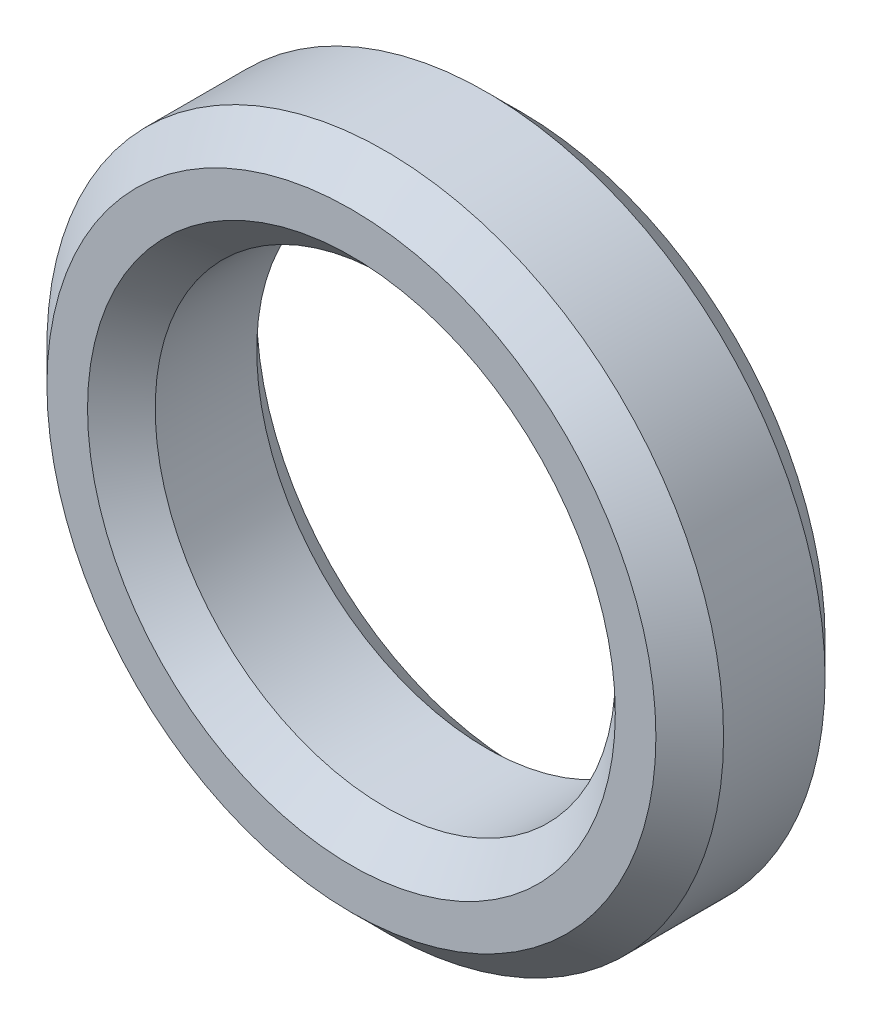
ISO-10303-21;
HEADER;
FILE_DESCRIPTION(('STEP AP214'),'2;1');
FILE_NAME('part.step','',(''),(''),'','','');
FILE_SCHEMA(('AUTOMOTIVE_DESIGN { 1 0 10303 214 1 1 1 1 }'));
ENDSEC;
DATA;
#1=APPLICATION_CONTEXT('core data for automotive mechanical design processes');
#2=APPLICATION_PROTOCOL_DEFINITION('international standard','automotive_design',2000,#1);
#3=PRODUCT_CONTEXT('',#1,'mechanical');
#4=PRODUCT('Part','Part','',(#3));
#5=PRODUCT_RELATED_PRODUCT_CATEGORY('part','',(#4));
#6=PRODUCT_DEFINITION_FORMATION('','',#4);
#7=PRODUCT_DEFINITION_CONTEXT('part definition',#1,'design');
#8=PRODUCT_DEFINITION('design','',#6,#7);
#9=PRODUCT_DEFINITION_SHAPE('','',#8);
#10=(LENGTH_UNIT() NAMED_UNIT(*) SI_UNIT(.MILLI.,.METRE.));
#11=(NAMED_UNIT(*) PLANE_ANGLE_UNIT() SI_UNIT($,.RADIAN.));
#12=(NAMED_UNIT(*) SI_UNIT($,.STERADIAN.) SOLID_ANGLE_UNIT());
#13=UNCERTAINTY_MEASURE_WITH_UNIT(LENGTH_MEASURE(1.E-05),#10,'distance_accuracy_value','');
#14=(GEOMETRIC_REPRESENTATION_CONTEXT(3) GLOBAL_UNCERTAINTY_ASSIGNED_CONTEXT((#13)) GLOBAL_UNIT_ASSIGNED_CONTEXT((#10,
#11,#12)) REPRESENTATION_CONTEXT('',''));
#15=CARTESIAN_POINT('',(0.,0.,0.));
#16=DIRECTION('',(0.,0.,1.));
#17=DIRECTION('',(1.,0.,0.));
#18=AXIS2_PLACEMENT_3D('',#15,#16,#17);
#19=CARTESIAN_POINT('',(0.,0.,2.5));
#20=DIRECTION('',(0.,0.,-1.));
#21=DIRECTION('',(-1.,0.,0.));
#22=AXIS2_PLACEMENT_3D('',#19,#20,#21);
#23=CYLINDRICAL_SURFACE('',#22,6.8);
#24=CARTESIAN_POINT('',(0.,0.,1.5));
#25=DIRECTION('',(0.,0.,1.));
#26=DIRECTION('',(1.,0.,0.));
#27=AXIS2_PLACEMENT_3D('',#24,#25,#26);
#28=CIRCLE('',#27,6.8);
#29=CARTESIAN_POINT('',(6.8,0.,1.5));
#30=VERTEX_POINT('',#29);
#31=EDGE_CURVE('E67',#30,#30,#28,.T.);
#32=ORIENTED_EDGE('',*,*,#31,.T.);
#33=EDGE_LOOP('',(#32));
#34=FACE_BOUND('',#33,.T.);
#35=CARTESIAN_POINT('',(0.,0.,-1.5));
#36=DIRECTION('',(0.,0.,1.));
#37=DIRECTION('',(1.,0.,0.));
#38=AXIS2_PLACEMENT_3D('',#35,#36,#37);
#39=CIRCLE('',#38,6.8);
#40=CARTESIAN_POINT('',(6.8,0.,-1.5));
#41=VERTEX_POINT('',#40);
#42=EDGE_CURVE('E70',#41,#41,#39,.F.);
#43=ORIENTED_EDGE('',*,*,#42,.T.);
#44=EDGE_LOOP('',(#43));
#45=FACE_BOUND('',#44,.T.);
#46=ADVANCED_FACE('F40',(#34,#45),#23,.F.);
#47=CARTESIAN_POINT('',(0.,0.,2.5));
#48=DIRECTION('',(0.,0.,-1.));
#49=DIRECTION('',(-1.,0.,0.));
#50=AXIS2_PLACEMENT_3D('',#47,#48,#49);
#51=CYLINDRICAL_SURFACE('',#50,10.);
#52=CARTESIAN_POINT('',(0.,0.,1.5));
#53=DIRECTION('',(0.,0.,1.));
#54=DIRECTION('',(1.,0.,0.));
#55=AXIS2_PLACEMENT_3D('',#52,#53,#54);
#56=CIRCLE('',#55,10.);
#57=CARTESIAN_POINT('',(10.,0.,1.5));
#58=VERTEX_POINT('',#57);
#59=EDGE_CURVE('E52',#58,#58,#56,.F.);
#60=ORIENTED_EDGE('',*,*,#59,.T.);
#61=EDGE_LOOP('',(#60));
#62=FACE_BOUND('',#61,.T.);
#63=CARTESIAN_POINT('',(0.,0.,-1.5));
#64=DIRECTION('',(0.,0.,1.));
#65=DIRECTION('',(1.,0.,0.));
#66=AXIS2_PLACEMENT_3D('',#63,#64,#65);
#67=CIRCLE('',#66,10.);
#68=CARTESIAN_POINT('',(10.,0.,-1.5));
#69=VERTEX_POINT('',#68);
#70=EDGE_CURVE('E56',#69,#69,#67,.T.);
#71=ORIENTED_EDGE('',*,*,#70,.T.);
#72=EDGE_LOOP('',(#71));
#73=FACE_BOUND('',#72,.T.);
#74=ADVANCED_FACE('F89',(#62,#73),#51,.T.);
#75=CARTESIAN_POINT('',(0.,0.,2.5));
#76=DIRECTION('',(0.,0.,1.));
#77=DIRECTION('',(1.,0.,0.));
#78=AXIS2_PLACEMENT_3D('',#75,#76,#77);
#79=PLANE('',#78);
#80=CARTESIAN_POINT('',(0.,0.,2.5));
#81=DIRECTION('',(0.,0.,1.));
#82=DIRECTION('',(1.,0.,0.));
#83=AXIS2_PLACEMENT_3D('',#80,#81,#82);
#84=CIRCLE('',#83,7.80000000000001);
#85=CARTESIAN_POINT('',(7.80000000000001,0.,2.5));
#86=VERTEX_POINT('',#85);
#87=EDGE_CURVE('E61',#86,#86,#84,.F.);
#88=ORIENTED_EDGE('',*,*,#87,.T.);
#89=EDGE_LOOP('',(#88));
#90=FACE_BOUND('',#89,.T.);
#91=CARTESIAN_POINT('',(0.,0.,2.5));
#92=DIRECTION('',(0.,0.,1.));
#93=DIRECTION('',(1.,0.,0.));
#94=AXIS2_PLACEMENT_3D('',#91,#92,#93);
#95=CIRCLE('',#94,9.);
#96=CARTESIAN_POINT('',(9.,0.,2.5));
#97=VERTEX_POINT('',#96);
#98=EDGE_CURVE('E64',#97,#97,#95,.T.);
#99=ORIENTED_EDGE('',*,*,#98,.T.);
#100=EDGE_LOOP('',(#99));
#101=FACE_BOUND('',#100,.T.);
#102=ADVANCED_FACE('F95',(#90,#101),#79,.T.);
#103=CARTESIAN_POINT('',(0.,0.,-2.5));
#104=DIRECTION('',(0.,0.,1.));
#105=DIRECTION('',(1.,0.,0.));
#106=AXIS2_PLACEMENT_3D('',#103,#104,#105);
#107=PLANE('',#106);
#108=CARTESIAN_POINT('',(0.,0.,-2.5));
#109=DIRECTION('',(0.,0.,1.));
#110=DIRECTION('',(1.,0.,0.));
#111=AXIS2_PLACEMENT_3D('',#108,#109,#110);
#112=CIRCLE('',#111,7.8);
#113=CARTESIAN_POINT('',(7.8,0.,-2.5));
#114=VERTEX_POINT('',#113);
#115=EDGE_CURVE('E11',#114,#114,#112,.T.);
#116=ORIENTED_EDGE('',*,*,#115,.T.);
#117=EDGE_LOOP('',(#116));
#118=FACE_BOUND('',#117,.T.);
#119=CARTESIAN_POINT('',(0.,0.,-2.5));
#120=DIRECTION('',(0.,0.,1.));
#121=DIRECTION('',(1.,0.,0.));
#122=AXIS2_PLACEMENT_3D('',#119,#120,#121);
#123=CIRCLE('',#122,9.);
#124=CARTESIAN_POINT('',(9.,0.,-2.5));
#125=VERTEX_POINT('',#124);
#126=EDGE_CURVE('E48',#125,#125,#123,.F.);
#127=ORIENTED_EDGE('',*,*,#126,.T.);
#128=EDGE_LOOP('',(#127));
#129=FACE_BOUND('',#128,.T.);
#130=ADVANCED_FACE('F105',(#118,#129),#107,.F.);
#131=CARTESIAN_POINT('',(0.,0.,1.5));
#132=DIRECTION('',(0.,0.,1.));
#133=DIRECTION('',(1.,0.,0.));
#134=AXIS2_PLACEMENT_3D('',#131,#132,#133);
#135=CONICAL_SURFACE('',#134,6.8,0.78539816339745);
#136=ORIENTED_EDGE('',*,*,#87,.F.);
#137=EDGE_LOOP('',(#136));
#138=FACE_BOUND('',#137,.T.);
#139=ORIENTED_EDGE('',*,*,#31,.F.);
#140=EDGE_LOOP('',(#139));
#141=FACE_BOUND('',#140,.T.);
#142=ADVANCED_FACE('F84',(#138,#141),#135,.F.);
#143=CARTESIAN_POINT('',(0.,0.,2.5));
#144=DIRECTION('',(0.,0.,-1.));
#145=DIRECTION('',(-1.,0.,0.));
#146=AXIS2_PLACEMENT_3D('',#143,#144,#145);
#147=CONICAL_SURFACE('',#146,9.,0.785398163397448);
#148=ORIENTED_EDGE('',*,*,#59,.F.);
#149=EDGE_LOOP('',(#148));
#150=FACE_BOUND('',#149,.T.);
#151=ORIENTED_EDGE('',*,*,#98,.F.);
#152=EDGE_LOOP('',(#151));
#153=FACE_BOUND('',#152,.T.);
#154=ADVANCED_FACE('F78',(#150,#153),#147,.T.);
#155=CARTESIAN_POINT('',(0.,0.,-2.5));
#156=DIRECTION('',(0.,0.,-1.));
#157=DIRECTION('',(-1.,0.,0.));
#158=AXIS2_PLACEMENT_3D('',#155,#156,#157);
#159=CONICAL_SURFACE('',#158,7.8,0.785398163397447);
#160=ORIENTED_EDGE('',*,*,#42,.F.);
#161=EDGE_LOOP('',(#160));
#162=FACE_BOUND('',#161,.T.);
#163=ORIENTED_EDGE('',*,*,#115,.F.);
#164=EDGE_LOOP('',(#163));
#165=FACE_BOUND('',#164,.T.);
#166=ADVANCED_FACE('F75',(#162,#165),#159,.F.);
#167=CARTESIAN_POINT('',(0.,0.,-1.5));
#168=DIRECTION('',(0.,0.,1.));
#169=DIRECTION('',(1.,0.,0.));
#170=AXIS2_PLACEMENT_3D('',#167,#168,#169);
#171=CONICAL_SURFACE('',#170,10.,0.78539816339745);
#172=ORIENTED_EDGE('',*,*,#126,.F.);
#173=EDGE_LOOP('',(#172));
#174=FACE_BOUND('',#173,.T.);
#175=ORIENTED_EDGE('',*,*,#70,.F.);
#176=EDGE_LOOP('',(#175));
#177=FACE_BOUND('',#176,.T.);
#178=ADVANCED_FACE('F43',(#174,#177),#171,.T.);
#179=CLOSED_SHELL('',(#46,#74,#102,#130,#142,#154,#166,#178));
#180=MANIFOLD_SOLID_BREP('B2',#179);
#181=ADVANCED_BREP_SHAPE_REPRESENTATION('',(#18,#180),#14);
#182=SHAPE_DEFINITION_REPRESENTATION(#9,#181);
ENDSEC;
END-ISO-10303-21;
